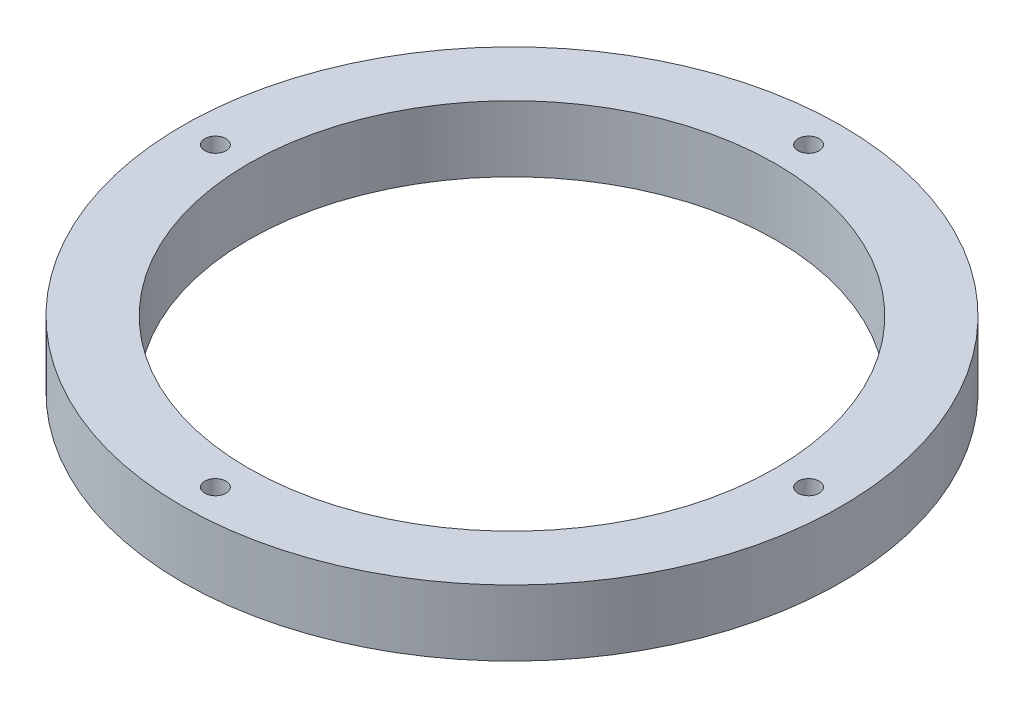
ISO-10303-21;
HEADER;
FILE_DESCRIPTION(('STEP AP214'),'2;1');
FILE_NAME('part.step','',(''),(''),'','','');
FILE_SCHEMA(('AUTOMOTIVE_DESIGN { 1 0 10303 214 1 1 1 1 }'));
ENDSEC;
DATA;
#1=APPLICATION_CONTEXT('core data for automotive mechanical design processes');
#2=APPLICATION_PROTOCOL_DEFINITION('international standard','automotive_design',2000,#1);
#3=PRODUCT_CONTEXT('',#1,'mechanical');
#4=PRODUCT('Part','Part','',(#3));
#5=PRODUCT_RELATED_PRODUCT_CATEGORY('part','',(#4));
#6=PRODUCT_DEFINITION_FORMATION('','',#4);
#7=PRODUCT_DEFINITION_CONTEXT('part definition',#1,'design');
#8=PRODUCT_DEFINITION('design','',#6,#7);
#9=PRODUCT_DEFINITION_SHAPE('','',#8);
#10=(LENGTH_UNIT() NAMED_UNIT(*) SI_UNIT(.MILLI.,.METRE.));
#11=(NAMED_UNIT(*) PLANE_ANGLE_UNIT() SI_UNIT($,.RADIAN.));
#12=(NAMED_UNIT(*) SI_UNIT($,.STERADIAN.) SOLID_ANGLE_UNIT());
#13=UNCERTAINTY_MEASURE_WITH_UNIT(LENGTH_MEASURE(1.E-05),#10,'distance_accuracy_value','');
#14=(GEOMETRIC_REPRESENTATION_CONTEXT(3) GLOBAL_UNCERTAINTY_ASSIGNED_CONTEXT((#13)) GLOBAL_UNIT_ASSIGNED_CONTEXT((#10,
#11,#12)) REPRESENTATION_CONTEXT('',''));
#15=CARTESIAN_POINT('',(0.,0.,0.));
#16=DIRECTION('',(0.,0.,1.));
#17=DIRECTION('',(1.,0.,0.));
#18=AXIS2_PLACEMENT_3D('',#15,#16,#17);
#19=CARTESIAN_POINT('',(0.,10.,0.));
#20=DIRECTION('',(0.,1.,0.));
#21=DIRECTION('',(0.,0.,1.));
#22=AXIS2_PLACEMENT_3D('',#19,#20,#21);
#23=PLANE('',#22);
#24=CARTESIAN_POINT('',(2.54142111694787E-12,10.,45.));
#25=DIRECTION('',(0.,1.,0.));
#26=DIRECTION('',(0.,0.,1.));
#27=AXIS2_PLACEMENT_3D('',#24,#25,#26);
#28=CIRCLE('',#27,1.60000000000273);
#29=CARTESIAN_POINT('',(2.54142111694787E-12,10.,46.6000000000027));
#30=VERTEX_POINT('',#29);
#31=EDGE_CURVE('E61',#30,#30,#28,.T.);
#32=ORIENTED_EDGE('',*,*,#31,.F.);
#33=EDGE_LOOP('',(#32));
#34=FACE_BOUND('',#33,.T.);
#35=CARTESIAN_POINT('',(0.,10.,-45.));
#36=DIRECTION('',(0.,1.,0.));
#37=DIRECTION('',(0.,0.,1.));
#38=AXIS2_PLACEMENT_3D('',#35,#36,#37);
#39=CIRCLE('',#38,1.6);
#40=CARTESIAN_POINT('',(0.,10.,-43.4));
#41=VERTEX_POINT('',#40);
#42=EDGE_CURVE('E49',#41,#41,#39,.T.);
#43=ORIENTED_EDGE('',*,*,#42,.F.);
#44=EDGE_LOOP('',(#43));
#45=FACE_BOUND('',#44,.T.);
#46=CARTESIAN_POINT('',(0.,10.,0.));
#47=DIRECTION('',(0.,1.,0.));
#48=DIRECTION('',(0.,0.,1.));
#49=AXIS2_PLACEMENT_3D('',#46,#47,#48);
#50=CIRCLE('',#49,50.);
#51=CARTESIAN_POINT('',(0.,10.,50.));
#52=VERTEX_POINT('',#51);
#53=EDGE_CURVE('E10',#52,#52,#50,.T.);
#54=ORIENTED_EDGE('',*,*,#53,.T.);
#55=EDGE_LOOP('',(#54));
#56=FACE_BOUND('',#55,.T.);
#57=CARTESIAN_POINT('',(0.,10.,0.));
#58=DIRECTION('',(0.,1.,0.));
#59=DIRECTION('',(0.,0.,1.));
#60=AXIS2_PLACEMENT_3D('',#57,#58,#59);
#61=CIRCLE('',#60,40.);
#62=CARTESIAN_POINT('',(0.,10.,40.));
#63=VERTEX_POINT('',#62);
#64=EDGE_CURVE('E44',#63,#63,#61,.T.);
#65=ORIENTED_EDGE('',*,*,#64,.F.);
#66=EDGE_LOOP('',(#65));
#67=FACE_BOUND('',#66,.T.);
#68=CARTESIAN_POINT('',(45.0000000000013,10.,-1.27071055847394E-12));
#69=DIRECTION('',(0.,1.,0.));
#70=DIRECTION('',(0.,0.,1.));
#71=AXIS2_PLACEMENT_3D('',#68,#69,#70);
#72=CIRCLE('',#71,1.60000000000099);
#73=CARTESIAN_POINT('',(45.0000000000013,10.,1.59999999999972));
#74=VERTEX_POINT('',#73);
#75=EDGE_CURVE('E55',#74,#74,#72,.T.);
#76=ORIENTED_EDGE('',*,*,#75,.F.);
#77=EDGE_LOOP('',(#76));
#78=FACE_BOUND('',#77,.T.);
#79=CARTESIAN_POINT('',(-44.9999999999987,10.,1.2762214690701E-12));
#80=DIRECTION('',(0.,1.,0.));
#81=DIRECTION('',(0.,0.,1.));
#82=AXIS2_PLACEMENT_3D('',#79,#80,#81);
#83=CIRCLE('',#82,1.60000000000204);
#84=CARTESIAN_POINT('',(-44.9999999999987,10.,1.60000000000332));
#85=VERTEX_POINT('',#84);
#86=EDGE_CURVE('E67',#85,#85,#83,.T.);
#87=ORIENTED_EDGE('',*,*,#86,.F.);
#88=EDGE_LOOP('',(#87));
#89=FACE_BOUND('',#88,.T.);
#90=ADVANCED_FACE('F33',(#34,#45,#56,#67,#78,#89),#23,.T.);
#91=CARTESIAN_POINT('',(0.,0.,0.));
#92=DIRECTION('',(0.,1.,0.));
#93=DIRECTION('',(0.,0.,1.));
#94=AXIS2_PLACEMENT_3D('',#91,#92,#93);
#95=PLANE('',#94);
#96=CARTESIAN_POINT('',(0.,0.,0.));
#97=DIRECTION('',(0.,1.,0.));
#98=DIRECTION('',(0.,0.,1.));
#99=AXIS2_PLACEMENT_3D('',#96,#97,#98);
#100=CIRCLE('',#99,50.);
#101=CARTESIAN_POINT('',(0.,0.,50.));
#102=VERTEX_POINT('',#101);
#103=EDGE_CURVE('E37',#102,#102,#100,.T.);
#104=ORIENTED_EDGE('',*,*,#103,.F.);
#105=EDGE_LOOP('',(#104));
#106=FACE_BOUND('',#105,.T.);
#107=CARTESIAN_POINT('',(0.,0.,0.));
#108=DIRECTION('',(0.,1.,0.));
#109=DIRECTION('',(0.,0.,1.));
#110=AXIS2_PLACEMENT_3D('',#107,#108,#109);
#111=CIRCLE('',#110,40.);
#112=CARTESIAN_POINT('',(0.,0.,40.));
#113=VERTEX_POINT('',#112);
#114=EDGE_CURVE('E46',#113,#113,#111,.T.);
#115=ORIENTED_EDGE('',*,*,#114,.T.);
#116=EDGE_LOOP('',(#115));
#117=FACE_BOUND('',#116,.T.);
#118=CARTESIAN_POINT('',(0.,0.,-45.));
#119=DIRECTION('',(0.,1.,0.));
#120=DIRECTION('',(0.,0.,1.));
#121=AXIS2_PLACEMENT_3D('',#118,#119,#120);
#122=CIRCLE('',#121,1.6);
#123=CARTESIAN_POINT('',(0.,0.,-43.4));
#124=VERTEX_POINT('',#123);
#125=EDGE_CURVE('E52',#124,#124,#122,.T.);
#126=ORIENTED_EDGE('',*,*,#125,.T.);
#127=EDGE_LOOP('',(#126));
#128=FACE_BOUND('',#127,.T.);
#129=CARTESIAN_POINT('',(45.0000000000013,0.,-1.27071055847394E-12));
#130=DIRECTION('',(0.,1.,0.));
#131=DIRECTION('',(0.,0.,1.));
#132=AXIS2_PLACEMENT_3D('',#129,#130,#131);
#133=CIRCLE('',#132,1.60000000000099);
#134=CARTESIAN_POINT('',(45.0000000000013,0.,1.59999999999972));
#135=VERTEX_POINT('',#134);
#136=EDGE_CURVE('E58',#135,#135,#133,.T.);
#137=ORIENTED_EDGE('',*,*,#136,.T.);
#138=EDGE_LOOP('',(#137));
#139=FACE_BOUND('',#138,.T.);
#140=CARTESIAN_POINT('',(2.54142111694787E-12,0.,45.));
#141=DIRECTION('',(0.,1.,0.));
#142=DIRECTION('',(0.,0.,1.));
#143=AXIS2_PLACEMENT_3D('',#140,#141,#142);
#144=CIRCLE('',#143,1.60000000000273);
#145=CARTESIAN_POINT('',(2.54142111694787E-12,0.,46.6000000000027));
#146=VERTEX_POINT('',#145);
#147=EDGE_CURVE('E64',#146,#146,#144,.T.);
#148=ORIENTED_EDGE('',*,*,#147,.T.);
#149=EDGE_LOOP('',(#148));
#150=FACE_BOUND('',#149,.T.);
#151=CARTESIAN_POINT('',(-44.9999999999987,0.,1.2762214690701E-12));
#152=DIRECTION('',(0.,1.,0.));
#153=DIRECTION('',(0.,0.,1.));
#154=AXIS2_PLACEMENT_3D('',#151,#152,#153);
#155=CIRCLE('',#154,1.60000000000204);
#156=CARTESIAN_POINT('',(-44.9999999999987,0.,1.60000000000332));
#157=VERTEX_POINT('',#156);
#158=EDGE_CURVE('E70',#157,#157,#155,.T.);
#159=ORIENTED_EDGE('',*,*,#158,.T.);
#160=EDGE_LOOP('',(#159));
#161=FACE_BOUND('',#160,.T.);
#162=ADVANCED_FACE('F80',(#106,#117,#128,#139,#150,#161),#95,.F.);
#163=CARTESIAN_POINT('',(0.,10.,0.));
#164=DIRECTION('',(0.,-1.,0.));
#165=DIRECTION('',(0.,0.,-1.));
#166=AXIS2_PLACEMENT_3D('',#163,#164,#165);
#167=CYLINDRICAL_SURFACE('',#166,50.);
#168=ORIENTED_EDGE('',*,*,#53,.F.);
#169=EDGE_LOOP('',(#168));
#170=FACE_BOUND('',#169,.T.);
#171=ORIENTED_EDGE('',*,*,#103,.T.);
#172=EDGE_LOOP('',(#171));
#173=FACE_BOUND('',#172,.T.);
#174=ADVANCED_FACE('F35',(#170,#173),#167,.T.);
#175=CARTESIAN_POINT('',(0.,10.,0.));
#176=DIRECTION('',(0.,-1.,0.));
#177=DIRECTION('',(0.,0.,-1.));
#178=AXIS2_PLACEMENT_3D('',#175,#176,#177);
#179=CYLINDRICAL_SURFACE('',#178,40.);
#180=ORIENTED_EDGE('',*,*,#64,.T.);
#181=EDGE_LOOP('',(#180));
#182=FACE_BOUND('',#181,.T.);
#183=ORIENTED_EDGE('',*,*,#114,.F.);
#184=EDGE_LOOP('',(#183));
#185=FACE_BOUND('',#184,.T.);
#186=ADVANCED_FACE('F90',(#182,#185),#179,.F.);
#187=CARTESIAN_POINT('',(0.,10.,-45.));
#188=DIRECTION('',(0.,-1.,0.));
#189=DIRECTION('',(0.,0.,-1.));
#190=AXIS2_PLACEMENT_3D('',#187,#188,#189);
#191=CYLINDRICAL_SURFACE('',#190,1.6);
#192=ORIENTED_EDGE('',*,*,#42,.T.);
#193=EDGE_LOOP('',(#192));
#194=FACE_BOUND('',#193,.T.);
#195=ORIENTED_EDGE('',*,*,#125,.F.);
#196=EDGE_LOOP('',(#195));
#197=FACE_BOUND('',#196,.T.);
#198=ADVANCED_FACE('F93',(#194,#197),#191,.F.);
#199=CARTESIAN_POINT('',(45.0000000000013,10.,-1.27071055847394E-12));
#200=DIRECTION('',(0.,-1.,0.));
#201=DIRECTION('',(0.,0.,-1.));
#202=AXIS2_PLACEMENT_3D('',#199,#200,#201);
#203=CYLINDRICAL_SURFACE('',#202,1.60000000000099);
#204=ORIENTED_EDGE('',*,*,#75,.T.);
#205=EDGE_LOOP('',(#204));
#206=FACE_BOUND('',#205,.T.);
#207=ORIENTED_EDGE('',*,*,#136,.F.);
#208=EDGE_LOOP('',(#207));
#209=FACE_BOUND('',#208,.T.);
#210=ADVANCED_FACE('F97',(#206,#209),#203,.F.);
#211=CARTESIAN_POINT('',(2.54142111694787E-12,10.,45.));
#212=DIRECTION('',(0.,-1.,0.));
#213=DIRECTION('',(0.,0.,-1.));
#214=AXIS2_PLACEMENT_3D('',#211,#212,#213);
#215=CYLINDRICAL_SURFACE('',#214,1.60000000000273);
#216=ORIENTED_EDGE('',*,*,#31,.T.);
#217=EDGE_LOOP('',(#216));
#218=FACE_BOUND('',#217,.T.);
#219=ORIENTED_EDGE('',*,*,#147,.F.);
#220=EDGE_LOOP('',(#219));
#221=FACE_BOUND('',#220,.T.);
#222=ADVANCED_FACE('F101',(#218,#221),#215,.F.);
#223=CARTESIAN_POINT('',(-44.9999999999987,10.,1.2762214690701E-12));
#224=DIRECTION('',(0.,-1.,0.));
#225=DIRECTION('',(0.,0.,-1.));
#226=AXIS2_PLACEMENT_3D('',#223,#224,#225);
#227=CYLINDRICAL_SURFACE('',#226,1.60000000000204);
#228=ORIENTED_EDGE('',*,*,#86,.T.);
#229=EDGE_LOOP('',(#228));
#230=FACE_BOUND('',#229,.T.);
#231=ORIENTED_EDGE('',*,*,#158,.F.);
#232=EDGE_LOOP('',(#231));
#233=FACE_BOUND('',#232,.T.);
#234=ADVANCED_FACE('F76',(#230,#233),#227,.F.);
#235=CLOSED_SHELL('',(#90,#162,#174,#186,#198,#210,#222,#234));
#236=MANIFOLD_SOLID_BREP('B2',#235);
#237=ADVANCED_BREP_SHAPE_REPRESENTATION('',(#18,#236),#14);
#238=SHAPE_DEFINITION_REPRESENTATION(#9,#237);
ENDSEC;
END-ISO-10303-21;
